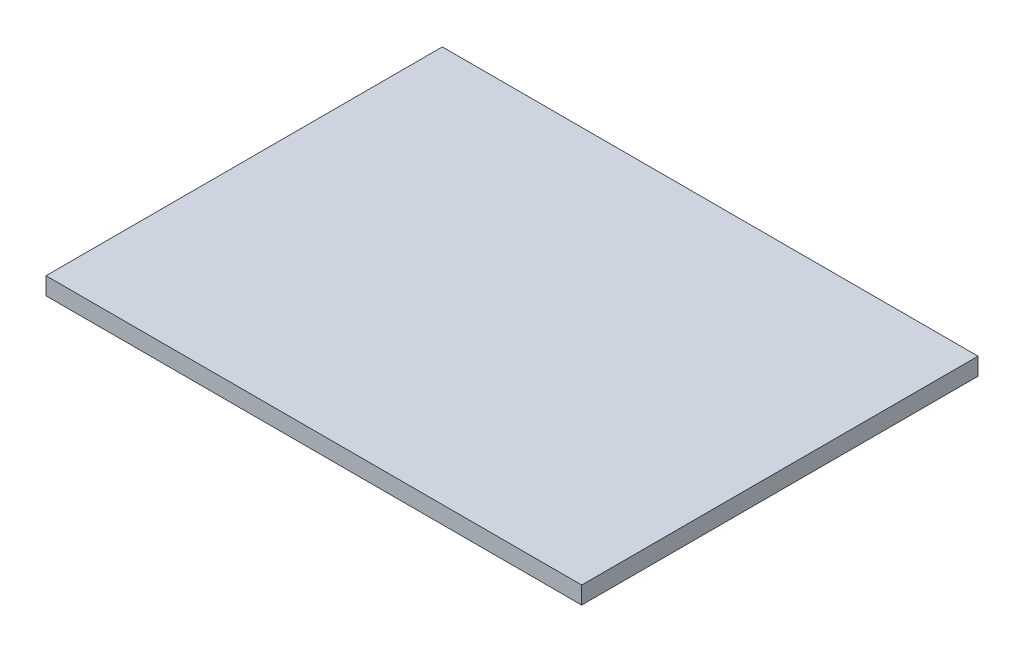
ISO-10303-21;
HEADER;
FILE_DESCRIPTION(('STEP AP214'),'2;1');
FILE_NAME('part.step','',(''),(''),'','','');
FILE_SCHEMA(('AUTOMOTIVE_DESIGN { 1 0 10303 214 1 1 1 1 }'));
ENDSEC;
DATA;
#1=APPLICATION_CONTEXT('core data for automotive mechanical design processes');
#2=APPLICATION_PROTOCOL_DEFINITION('international standard','automotive_design',2000,#1);
#3=PRODUCT_CONTEXT('',#1,'mechanical');
#4=PRODUCT('Part','Part','',(#3));
#5=PRODUCT_RELATED_PRODUCT_CATEGORY('part','',(#4));
#6=PRODUCT_DEFINITION_FORMATION('','',#4);
#7=PRODUCT_DEFINITION_CONTEXT('part definition',#1,'design');
#8=PRODUCT_DEFINITION('design','',#6,#7);
#9=PRODUCT_DEFINITION_SHAPE('','',#8);
#10=(LENGTH_UNIT() NAMED_UNIT(*) SI_UNIT(.MILLI.,.METRE.));
#11=(NAMED_UNIT(*) PLANE_ANGLE_UNIT() SI_UNIT($,.RADIAN.));
#12=(NAMED_UNIT(*) SI_UNIT($,.STERADIAN.) SOLID_ANGLE_UNIT());
#13=UNCERTAINTY_MEASURE_WITH_UNIT(LENGTH_MEASURE(1.E-05),#10,'distance_accuracy_value','');
#14=(GEOMETRIC_REPRESENTATION_CONTEXT(3) GLOBAL_UNCERTAINTY_ASSIGNED_CONTEXT((#13)) GLOBAL_UNIT_ASSIGNED_CONTEXT((#10,
#11,#12)) REPRESENTATION_CONTEXT('',''));
#15=CARTESIAN_POINT('',(0.,0.,0.));
#16=DIRECTION('',(0.,0.,1.));
#17=DIRECTION('',(1.,0.,0.));
#18=AXIS2_PLACEMENT_3D('',#15,#16,#17);
#19=CARTESIAN_POINT('',(97.63125,6.35,72.23125));
#20=DIRECTION('',(-1.,0.,0.));
#21=DIRECTION('',(0.,0.,1.));
#22=AXIS2_PLACEMENT_3D('',#19,#20,#21);
#23=PLANE('',#22);
#24=DIRECTION('',(0.,0.,-1.));
#25=VECTOR('',#24,1.);
#26=CARTESIAN_POINT('',(97.63125,0.,72.23125));
#27=LINE('',#26,#25);
#28=CARTESIAN_POINT('',(97.63125,0.,72.23125));
#29=VERTEX_POINT('',#28);
#30=CARTESIAN_POINT('',(97.63125,0.,-72.23125));
#31=VERTEX_POINT('',#30);
#32=EDGE_CURVE('E107',#29,#31,#27,.T.);
#33=ORIENTED_EDGE('',*,*,#32,.T.);
#34=DIRECTION('',(0.,-1.,0.));
#35=VECTOR('',#34,1.);
#36=CARTESIAN_POINT('',(97.63125,6.35,-72.23125));
#37=LINE('',#36,#35);
#38=CARTESIAN_POINT('',(97.63125,6.35,-72.23125));
#39=VERTEX_POINT('',#38);
#40=EDGE_CURVE('E11',#39,#31,#37,.T.);
#41=ORIENTED_EDGE('',*,*,#40,.F.);
#42=DIRECTION('',(0.,0.,-1.));
#43=VECTOR('',#42,1.);
#44=CARTESIAN_POINT('',(97.63125,6.35,72.23125));
#45=LINE('',#44,#43);
#46=CARTESIAN_POINT('',(97.63125,6.35,72.23125));
#47=VERTEX_POINT('',#46);
#48=EDGE_CURVE('E91',#47,#39,#45,.T.);
#49=ORIENTED_EDGE('',*,*,#48,.F.);
#50=DIRECTION('',(0.,-1.,0.));
#51=VECTOR('',#50,1.);
#52=CARTESIAN_POINT('',(97.63125,6.35,72.23125));
#53=LINE('',#52,#51);
#54=EDGE_CURVE('E103',#47,#29,#53,.T.);
#55=ORIENTED_EDGE('',*,*,#54,.T.);
#56=EDGE_LOOP('',(#33,#41,#49,#55));
#57=FACE_BOUND('',#56,.T.);
#58=ADVANCED_FACE('F39',(#57),#23,.F.);
#59=CARTESIAN_POINT('',(-97.63125,6.35,-72.23125));
#60=DIRECTION('',(0.,0.,1.));
#61=DIRECTION('',(1.,0.,0.));
#62=AXIS2_PLACEMENT_3D('',#59,#60,#61);
#63=PLANE('',#62);
#64=DIRECTION('',(-1.,0.,0.));
#65=VECTOR('',#64,1.);
#66=CARTESIAN_POINT('',(-97.63125,0.,-72.23125));
#67=LINE('',#66,#65);
#68=CARTESIAN_POINT('',(-97.63125,0.,-72.23125));
#69=VERTEX_POINT('',#68);
#70=EDGE_CURVE('E96',#31,#69,#67,.T.);
#71=ORIENTED_EDGE('',*,*,#70,.T.);
#72=DIRECTION('',(0.,-1.,0.));
#73=VECTOR('',#72,1.);
#74=CARTESIAN_POINT('',(-97.63125,6.35,-72.23125));
#75=LINE('',#74,#73);
#76=CARTESIAN_POINT('',(-97.63125,6.35,-72.23125));
#77=VERTEX_POINT('',#76);
#78=EDGE_CURVE('E48',#77,#69,#75,.T.);
#79=ORIENTED_EDGE('',*,*,#78,.F.);
#80=DIRECTION('',(-1.,0.,0.));
#81=VECTOR('',#80,1.);
#82=CARTESIAN_POINT('',(-97.63125,6.35,-72.23125));
#83=LINE('',#82,#81);
#84=EDGE_CURVE('E86',#39,#77,#83,.T.);
#85=ORIENTED_EDGE('',*,*,#84,.F.);
#86=ORIENTED_EDGE('',*,*,#40,.T.);
#87=EDGE_LOOP('',(#71,#79,#85,#86));
#88=FACE_BOUND('',#87,.T.);
#89=ADVANCED_FACE('F95',(#88),#63,.F.);
#90=CARTESIAN_POINT('',(-97.63125,6.35,72.23125));
#91=DIRECTION('',(1.,0.,0.));
#92=DIRECTION('',(0.,0.,-1.));
#93=AXIS2_PLACEMENT_3D('',#90,#91,#92);
#94=PLANE('',#93);
#95=DIRECTION('',(0.,0.,1.));
#96=VECTOR('',#95,1.);
#97=CARTESIAN_POINT('',(-97.63125,0.,72.23125));
#98=LINE('',#97,#96);
#99=CARTESIAN_POINT('',(-97.63125,0.,72.23125));
#100=VERTEX_POINT('',#99);
#101=EDGE_CURVE('E73',#69,#100,#98,.T.);
#102=ORIENTED_EDGE('',*,*,#101,.T.);
#103=DIRECTION('',(0.,-1.,0.));
#104=VECTOR('',#103,1.);
#105=CARTESIAN_POINT('',(-97.63125,6.35,72.23125));
#106=LINE('',#105,#104);
#107=CARTESIAN_POINT('',(-97.63125,6.35,72.23125));
#108=VERTEX_POINT('',#107);
#109=EDGE_CURVE('E98',#108,#100,#106,.T.);
#110=ORIENTED_EDGE('',*,*,#109,.F.);
#111=DIRECTION('',(0.,0.,1.));
#112=VECTOR('',#111,1.);
#113=CARTESIAN_POINT('',(-97.63125,6.35,72.23125));
#114=LINE('',#113,#112);
#115=EDGE_CURVE('E89',#77,#108,#114,.T.);
#116=ORIENTED_EDGE('',*,*,#115,.F.);
#117=ORIENTED_EDGE('',*,*,#78,.T.);
#118=EDGE_LOOP('',(#102,#110,#116,#117));
#119=FACE_BOUND('',#118,.T.);
#120=ADVANCED_FACE('F99',(#119),#94,.F.);
#121=CARTESIAN_POINT('',(-97.63125,6.35,72.23125));
#122=DIRECTION('',(0.,0.,-1.));
#123=DIRECTION('',(-1.,0.,0.));
#124=AXIS2_PLACEMENT_3D('',#121,#122,#123);
#125=PLANE('',#124);
#126=DIRECTION('',(1.,0.,0.));
#127=VECTOR('',#126,1.);
#128=CARTESIAN_POINT('',(-97.63125,0.,72.23125));
#129=LINE('',#128,#127);
#130=EDGE_CURVE('E79',#100,#29,#129,.T.);
#131=ORIENTED_EDGE('',*,*,#130,.T.);
#132=ORIENTED_EDGE('',*,*,#54,.F.);
#133=DIRECTION('',(1.,0.,0.));
#134=VECTOR('',#133,1.);
#135=CARTESIAN_POINT('',(-97.63125,6.35,72.23125));
#136=LINE('',#135,#134);
#137=EDGE_CURVE('E56',#108,#47,#136,.T.);
#138=ORIENTED_EDGE('',*,*,#137,.F.);
#139=ORIENTED_EDGE('',*,*,#109,.T.);
#140=EDGE_LOOP('',(#131,#132,#138,#139));
#141=FACE_BOUND('',#140,.T.);
#142=ADVANCED_FACE('F120',(#141),#125,.F.);
#143=CARTESIAN_POINT('',(0.,6.35,0.));
#144=DIRECTION('',(0.,-1.,0.));
#145=DIRECTION('',(0.,0.,-1.));
#146=AXIS2_PLACEMENT_3D('',#143,#144,#145);
#147=PLANE('',#146);
#148=ORIENTED_EDGE('',*,*,#48,.T.);
#149=ORIENTED_EDGE('',*,*,#84,.T.);
#150=ORIENTED_EDGE('',*,*,#115,.T.);
#151=ORIENTED_EDGE('',*,*,#137,.T.);
#152=EDGE_LOOP('',(#148,#149,#150,#151));
#153=FACE_BOUND('',#152,.T.);
#154=ADVANCED_FACE('F87',(#153),#147,.F.);
#155=CARTESIAN_POINT('',(0.,0.,0.));
#156=DIRECTION('',(0.,-1.,0.));
#157=DIRECTION('',(0.,0.,-1.));
#158=AXIS2_PLACEMENT_3D('',#155,#156,#157);
#159=PLANE('',#158);
#160=ORIENTED_EDGE('',*,*,#32,.F.);
#161=ORIENTED_EDGE('',*,*,#130,.F.);
#162=ORIENTED_EDGE('',*,*,#101,.F.);
#163=ORIENTED_EDGE('',*,*,#70,.F.);
#164=EDGE_LOOP('',(#160,#161,#162,#163));
#165=FACE_BOUND('',#164,.T.);
#166=ADVANCED_FACE('F123',(#165),#159,.T.);
#167=CLOSED_SHELL('',(#58,#89,#120,#142,#154,#166));
#168=MANIFOLD_SOLID_BREP('B2',#167);
#169=ADVANCED_BREP_SHAPE_REPRESENTATION('',(#18,#168),#14);
#170=SHAPE_DEFINITION_REPRESENTATION(#9,#169);
ENDSEC;
END-ISO-10303-21;
